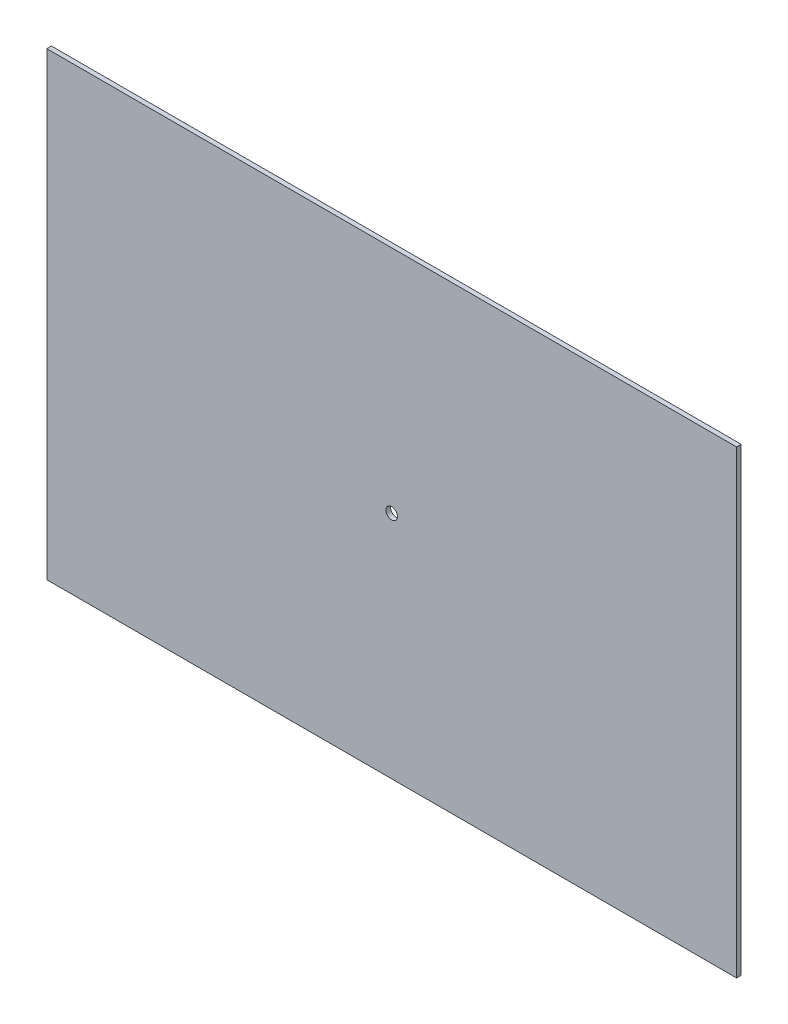
ISO-10303-21;
HEADER;
FILE_DESCRIPTION(('STEP AP214'),'2;1');
FILE_NAME('part.step','',(''),(''),'','','');
FILE_SCHEMA(('AUTOMOTIVE_DESIGN { 1 0 10303 214 1 1 1 1 }'));
ENDSEC;
DATA;
#1=APPLICATION_CONTEXT('core data for automotive mechanical design processes');
#2=APPLICATION_PROTOCOL_DEFINITION('international standard','automotive_design',2000,#1);
#3=PRODUCT_CONTEXT('',#1,'mechanical');
#4=PRODUCT('Part','Part','',(#3));
#5=PRODUCT_RELATED_PRODUCT_CATEGORY('part','',(#4));
#6=PRODUCT_DEFINITION_FORMATION('','',#4);
#7=PRODUCT_DEFINITION_CONTEXT('part definition',#1,'design');
#8=PRODUCT_DEFINITION('design','',#6,#7);
#9=PRODUCT_DEFINITION_SHAPE('','',#8);
#10=(LENGTH_UNIT() NAMED_UNIT(*) SI_UNIT(.MILLI.,.METRE.));
#11=(NAMED_UNIT(*) PLANE_ANGLE_UNIT() SI_UNIT($,.RADIAN.));
#12=(NAMED_UNIT(*) SI_UNIT($,.STERADIAN.) SOLID_ANGLE_UNIT());
#13=UNCERTAINTY_MEASURE_WITH_UNIT(LENGTH_MEASURE(1.E-05),#10,'distance_accuracy_value','');
#14=(GEOMETRIC_REPRESENTATION_CONTEXT(3) GLOBAL_UNCERTAINTY_ASSIGNED_CONTEXT((#13)) GLOBAL_UNIT_ASSIGNED_CONTEXT((#10,
#11,#12)) REPRESENTATION_CONTEXT('',''));
#15=CARTESIAN_POINT('',(0.,0.,0.));
#16=DIRECTION('',(0.,0.,1.));
#17=DIRECTION('',(1.,0.,0.));
#18=AXIS2_PLACEMENT_3D('',#15,#16,#17);
#19=CARTESIAN_POINT('',(150.,100.,2.));
#20=DIRECTION('',(-1.,0.,0.));
#21=DIRECTION('',(0.,0.,1.));
#22=AXIS2_PLACEMENT_3D('',#19,#20,#21);
#23=PLANE('',#22);
#24=DIRECTION('',(0.,1.,0.));
#25=VECTOR('',#24,1.);
#26=CARTESIAN_POINT('',(150.,100.,0.));
#27=LINE('',#26,#25);
#28=CARTESIAN_POINT('',(150.,-100.,0.));
#29=VERTEX_POINT('',#28);
#30=CARTESIAN_POINT('',(150.,100.,0.));
#31=VERTEX_POINT('',#30);
#32=EDGE_CURVE('E98',#29,#31,#27,.T.);
#33=ORIENTED_EDGE('',*,*,#32,.T.);
#34=DIRECTION('',(0.,0.,-1.));
#35=VECTOR('',#34,1.);
#36=CARTESIAN_POINT('',(150.,100.,2.));
#37=LINE('',#36,#35);
#38=CARTESIAN_POINT('',(150.,100.,2.));
#39=VERTEX_POINT('',#38);
#40=EDGE_CURVE('E11',#39,#31,#37,.T.);
#41=ORIENTED_EDGE('',*,*,#40,.F.);
#42=DIRECTION('',(0.,1.,0.));
#43=VECTOR('',#42,1.);
#44=CARTESIAN_POINT('',(150.,100.,2.));
#45=LINE('',#44,#43);
#46=CARTESIAN_POINT('',(150.,-100.,2.));
#47=VERTEX_POINT('',#46);
#48=EDGE_CURVE('E86',#47,#39,#45,.T.);
#49=ORIENTED_EDGE('',*,*,#48,.F.);
#50=DIRECTION('',(0.,0.,-1.));
#51=VECTOR('',#50,1.);
#52=CARTESIAN_POINT('',(150.,-100.,2.));
#53=LINE('',#52,#51);
#54=EDGE_CURVE('E94',#47,#29,#53,.T.);
#55=ORIENTED_EDGE('',*,*,#54,.T.);
#56=EDGE_LOOP('',(#33,#41,#49,#55));
#57=FACE_BOUND('',#56,.T.);
#58=ADVANCED_FACE('F35',(#57),#23,.F.);
#59=CARTESIAN_POINT('',(-150.,100.,2.));
#60=DIRECTION('',(0.,-1.,0.));
#61=DIRECTION('',(0.,0.,-1.));
#62=AXIS2_PLACEMENT_3D('',#59,#60,#61);
#63=PLANE('',#62);
#64=DIRECTION('',(-1.,0.,0.));
#65=VECTOR('',#64,1.);
#66=CARTESIAN_POINT('',(-150.,100.,0.));
#67=LINE('',#66,#65);
#68=CARTESIAN_POINT('',(-150.,100.,0.));
#69=VERTEX_POINT('',#68);
#70=EDGE_CURVE('E90',#31,#69,#67,.T.);
#71=ORIENTED_EDGE('',*,*,#70,.T.);
#72=DIRECTION('',(0.,0.,-1.));
#73=VECTOR('',#72,1.);
#74=CARTESIAN_POINT('',(-150.,100.,2.));
#75=LINE('',#74,#73);
#76=CARTESIAN_POINT('',(-150.,100.,2.));
#77=VERTEX_POINT('',#76);
#78=EDGE_CURVE('E43',#77,#69,#75,.T.);
#79=ORIENTED_EDGE('',*,*,#78,.F.);
#80=DIRECTION('',(-1.,0.,0.));
#81=VECTOR('',#80,1.);
#82=CARTESIAN_POINT('',(-150.,100.,2.));
#83=LINE('',#82,#81);
#84=EDGE_CURVE('E81',#39,#77,#83,.T.);
#85=ORIENTED_EDGE('',*,*,#84,.F.);
#86=ORIENTED_EDGE('',*,*,#40,.T.);
#87=EDGE_LOOP('',(#71,#79,#85,#86));
#88=FACE_BOUND('',#87,.T.);
#89=ADVANCED_FACE('F89',(#88),#63,.F.);
#90=CARTESIAN_POINT('',(-150.,100.,2.));
#91=DIRECTION('',(1.,0.,0.));
#92=DIRECTION('',(0.,1.,0.));
#93=AXIS2_PLACEMENT_3D('',#90,#91,#92);
#94=PLANE('',#93);
#95=DIRECTION('',(0.,-1.,0.));
#96=VECTOR('',#95,1.);
#97=CARTESIAN_POINT('',(-150.,100.,0.));
#98=LINE('',#97,#96);
#99=CARTESIAN_POINT('',(-150.,-100.,0.));
#100=VERTEX_POINT('',#99);
#101=EDGE_CURVE('E68',#69,#100,#98,.T.);
#102=ORIENTED_EDGE('',*,*,#101,.T.);
#103=DIRECTION('',(0.,0.,-1.));
#104=VECTOR('',#103,1.);
#105=CARTESIAN_POINT('',(-150.,-100.,2.));
#106=LINE('',#105,#104);
#107=CARTESIAN_POINT('',(-150.,-100.,2.));
#108=VERTEX_POINT('',#107);
#109=EDGE_CURVE('E91',#108,#100,#106,.T.);
#110=ORIENTED_EDGE('',*,*,#109,.F.);
#111=DIRECTION('',(0.,-1.,0.));
#112=VECTOR('',#111,1.);
#113=CARTESIAN_POINT('',(-150.,100.,2.));
#114=LINE('',#113,#112);
#115=EDGE_CURVE('E84',#77,#108,#114,.T.);
#116=ORIENTED_EDGE('',*,*,#115,.F.);
#117=ORIENTED_EDGE('',*,*,#78,.T.);
#118=EDGE_LOOP('',(#102,#110,#116,#117));
#119=FACE_BOUND('',#118,.T.);
#120=ADVANCED_FACE('F92',(#119),#94,.F.);
#121=CARTESIAN_POINT('',(-150.,-100.,2.));
#122=DIRECTION('',(0.,1.,0.));
#123=DIRECTION('',(0.,0.,1.));
#124=AXIS2_PLACEMENT_3D('',#121,#122,#123);
#125=PLANE('',#124);
#126=DIRECTION('',(1.,0.,0.));
#127=VECTOR('',#126,1.);
#128=CARTESIAN_POINT('',(-150.,-100.,0.));
#129=LINE('',#128,#127);
#130=EDGE_CURVE('E74',#100,#29,#129,.T.);
#131=ORIENTED_EDGE('',*,*,#130,.T.);
#132=ORIENTED_EDGE('',*,*,#54,.F.);
#133=DIRECTION('',(1.,0.,0.));
#134=VECTOR('',#133,1.);
#135=CARTESIAN_POINT('',(-150.,-100.,2.));
#136=LINE('',#135,#134);
#137=EDGE_CURVE('E51',#108,#47,#136,.T.);
#138=ORIENTED_EDGE('',*,*,#137,.F.);
#139=ORIENTED_EDGE('',*,*,#109,.T.);
#140=EDGE_LOOP('',(#131,#132,#138,#139));
#141=FACE_BOUND('',#140,.T.);
#142=ADVANCED_FACE('F106',(#141),#125,.F.);
#143=CARTESIAN_POINT('',(0.,0.,2.));
#144=DIRECTION('',(0.,0.,1.));
#145=DIRECTION('',(1.,0.,0.));
#146=AXIS2_PLACEMENT_3D('',#143,#144,#145);
#147=PLANE('',#146);
#148=CARTESIAN_POINT('',(0.,0.,2.));
#149=DIRECTION('',(0.,0.,1.));
#150=DIRECTION('',(1.,0.,0.));
#151=AXIS2_PLACEMENT_3D('',#148,#149,#150);
#152=CIRCLE('',#151,2.5);
#153=CARTESIAN_POINT('',(2.5,0.,2.));
#154=VERTEX_POINT('',#153);
#155=EDGE_CURVE('E112',#154,#154,#152,.T.);
#156=ORIENTED_EDGE('',*,*,#155,.F.);
#157=EDGE_LOOP('',(#156));
#158=FACE_BOUND('',#157,.T.);
#159=ORIENTED_EDGE('',*,*,#48,.T.);
#160=ORIENTED_EDGE('',*,*,#84,.T.);
#161=ORIENTED_EDGE('',*,*,#115,.T.);
#162=ORIENTED_EDGE('',*,*,#137,.T.);
#163=EDGE_LOOP('',(#159,#160,#161,#162));
#164=FACE_BOUND('',#163,.T.);
#165=ADVANCED_FACE('F82',(#158,#164),#147,.T.);
#166=CARTESIAN_POINT('',(0.,0.,0.));
#167=DIRECTION('',(0.,0.,1.));
#168=DIRECTION('',(1.,0.,0.));
#169=AXIS2_PLACEMENT_3D('',#166,#167,#168);
#170=PLANE('',#169);
#171=CARTESIAN_POINT('',(0.,0.,0.));
#172=DIRECTION('',(0.,0.,1.));
#173=DIRECTION('',(1.,0.,0.));
#174=AXIS2_PLACEMENT_3D('',#171,#172,#173);
#175=CIRCLE('',#174,2.5);
#176=CARTESIAN_POINT('',(2.5,0.,0.));
#177=VERTEX_POINT('',#176);
#178=EDGE_CURVE('E101',#177,#177,#175,.T.);
#179=ORIENTED_EDGE('',*,*,#178,.T.);
#180=EDGE_LOOP('',(#179));
#181=FACE_BOUND('',#180,.T.);
#182=ORIENTED_EDGE('',*,*,#32,.F.);
#183=ORIENTED_EDGE('',*,*,#130,.F.);
#184=ORIENTED_EDGE('',*,*,#101,.F.);
#185=ORIENTED_EDGE('',*,*,#70,.F.);
#186=EDGE_LOOP('',(#182,#183,#184,#185));
#187=FACE_BOUND('',#186,.T.);
#188=ADVANCED_FACE('F109',(#181,#187),#170,.F.);
#189=CARTESIAN_POINT('',(0.,0.,0.));
#190=DIRECTION('',(0.,0.,1.));
#191=DIRECTION('',(1.,0.,0.));
#192=AXIS2_PLACEMENT_3D('',#189,#190,#191);
#193=CYLINDRICAL_SURFACE('',#192,2.5);
#194=ORIENTED_EDGE('',*,*,#178,.F.);
#195=EDGE_LOOP('',(#194));
#196=FACE_BOUND('',#195,.T.);
#197=ORIENTED_EDGE('',*,*,#155,.T.);
#198=EDGE_LOOP('',(#197));
#199=FACE_BOUND('',#198,.T.);
#200=ADVANCED_FACE('F119',(#196,#199),#193,.F.);
#201=CLOSED_SHELL('',(#58,#89,#120,#142,#165,#188,#200));
#202=MANIFOLD_SOLID_BREP('B2',#201);
#203=ADVANCED_BREP_SHAPE_REPRESENTATION('',(#18,#202),#14);
#204=SHAPE_DEFINITION_REPRESENTATION(#9,#203);
ENDSEC;
END-ISO-10303-21;
